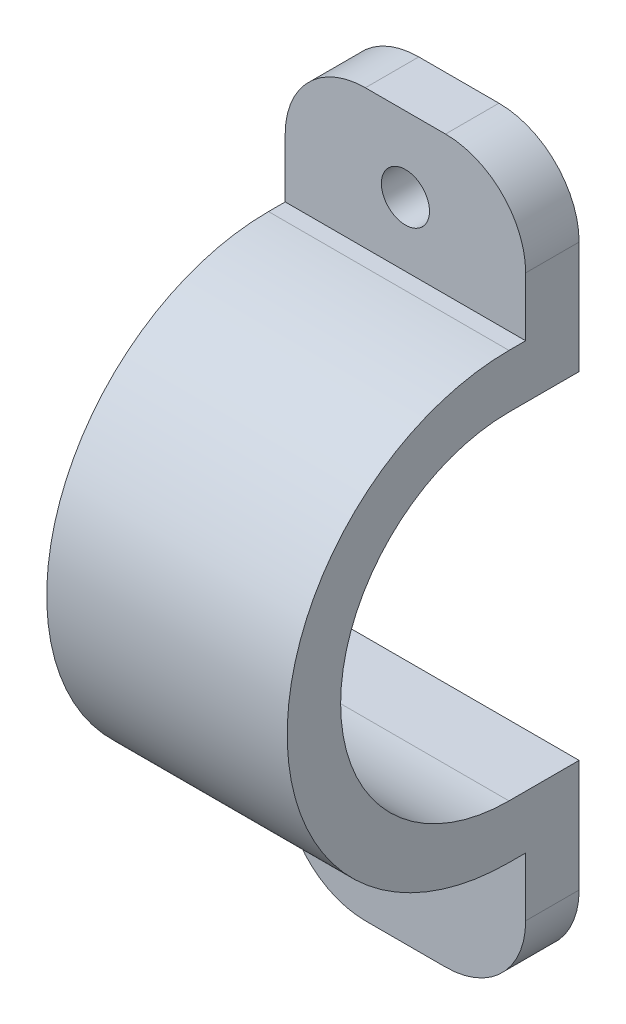
ISO-10303-21;
HEADER;
FILE_DESCRIPTION(('STEP AP214'),'2;1');
FILE_NAME('part.step','',(''),(''),'','','');
FILE_SCHEMA(('AUTOMOTIVE_DESIGN { 1 0 10303 214 1 1 1 1 }'));
ENDSEC;
DATA;
#1=APPLICATION_CONTEXT('core data for automotive mechanical design processes');
#2=APPLICATION_PROTOCOL_DEFINITION('international standard','automotive_design',2000,#1);
#3=PRODUCT_CONTEXT('',#1,'mechanical');
#4=PRODUCT('Part','Part','',(#3));
#5=PRODUCT_RELATED_PRODUCT_CATEGORY('part','',(#4));
#6=PRODUCT_DEFINITION_FORMATION('','',#4);
#7=PRODUCT_DEFINITION_CONTEXT('part definition',#1,'design');
#8=PRODUCT_DEFINITION('design','',#6,#7);
#9=PRODUCT_DEFINITION_SHAPE('','',#8);
#10=(LENGTH_UNIT() NAMED_UNIT(*) SI_UNIT(.MILLI.,.METRE.));
#11=(NAMED_UNIT(*) PLANE_ANGLE_UNIT() SI_UNIT($,.RADIAN.));
#12=(NAMED_UNIT(*) SI_UNIT($,.STERADIAN.) SOLID_ANGLE_UNIT());
#13=UNCERTAINTY_MEASURE_WITH_UNIT(LENGTH_MEASURE(1.E-05),#10,'distance_accuracy_value','');
#14=(GEOMETRIC_REPRESENTATION_CONTEXT(3) GLOBAL_UNCERTAINTY_ASSIGNED_CONTEXT((#13)) GLOBAL_UNIT_ASSIGNED_CONTEXT((#10,
#11,#12)) REPRESENTATION_CONTEXT('',''));
#15=CARTESIAN_POINT('',(0.,0.,0.));
#16=DIRECTION('',(0.,0.,1.));
#17=DIRECTION('',(1.,0.,0.));
#18=AXIS2_PLACEMENT_3D('',#15,#16,#17);
#19=CARTESIAN_POINT('',(18.,16.6,16.5));
#20=DIRECTION('',(0.,0.,-1.));
#21=DIRECTION('',(0.,1.,0.));
#22=AXIS2_PLACEMENT_3D('',#19,#20,#21);
#23=PLANE('',#22);
#24=DIRECTION('',(0.,-1.,0.));
#25=VECTOR('',#24,1.);
#26=CARTESIAN_POINT('',(18.,16.6,16.5));
#27=LINE('',#26,#25);
#28=CARTESIAN_POINT('',(18.,21.,16.5));
#29=VERTEX_POINT('',#28);
#30=CARTESIAN_POINT('',(18.,16.6,16.5));
#31=VERTEX_POINT('',#30);
#32=EDGE_CURVE('E149',#29,#31,#27,.T.);
#33=ORIENTED_EDGE('',*,*,#32,.F.);
#34=CARTESIAN_POINT('',(12.,21.,16.5));
#35=DIRECTION('',(0.,0.,-1.));
#36=DIRECTION('',(0.,1.,0.));
#37=AXIS2_PLACEMENT_3D('',#34,#35,#36);
#38=CIRCLE('',#37,6.);
#39=CARTESIAN_POINT('',(12.,27.,16.5));
#40=VERTEX_POINT('',#39);
#41=EDGE_CURVE('E185',#29,#40,#38,.F.);
#42=ORIENTED_EDGE('',*,*,#41,.T.);
#43=DIRECTION('',(-1.,0.,0.));
#44=VECTOR('',#43,1.);
#45=CARTESIAN_POINT('',(18.,27.,16.5));
#46=LINE('',#45,#44);
#47=CARTESIAN_POINT('',(6.,27.,16.5));
#48=VERTEX_POINT('',#47);
#49=EDGE_CURVE('E267',#40,#48,#46,.T.);
#50=ORIENTED_EDGE('',*,*,#49,.T.);
#51=CARTESIAN_POINT('',(6.,21.,16.5));
#52=DIRECTION('',(0.,0.,-1.));
#53=DIRECTION('',(0.,1.,0.));
#54=AXIS2_PLACEMENT_3D('',#51,#52,#53);
#55=CIRCLE('',#54,6.);
#56=CARTESIAN_POINT('',(0.,21.,16.5));
#57=VERTEX_POINT('',#56);
#58=EDGE_CURVE('E183',#48,#57,#55,.F.);
#59=ORIENTED_EDGE('',*,*,#58,.T.);
#60=DIRECTION('',(0.,-1.,0.));
#61=VECTOR('',#60,1.);
#62=CARTESIAN_POINT('',(0.,16.6,16.5));
#63=LINE('',#62,#61);
#64=CARTESIAN_POINT('',(0.,16.6,16.5));
#65=VERTEX_POINT('',#64);
#66=EDGE_CURVE('E172',#57,#65,#63,.T.);
#67=ORIENTED_EDGE('',*,*,#66,.T.);
#68=DIRECTION('',(-1.,0.,0.));
#69=VECTOR('',#68,1.);
#70=CARTESIAN_POINT('',(18.,16.6,16.5));
#71=LINE('',#70,#69);
#72=EDGE_CURVE('E164',#31,#65,#71,.T.);
#73=ORIENTED_EDGE('',*,*,#72,.F.);
#74=EDGE_LOOP('',(#33,#42,#50,#59,#67,#73));
#75=FACE_BOUND('',#74,.T.);
#76=CARTESIAN_POINT('',(9.,21.4,16.5));
#77=DIRECTION('',(0.,0.,1.));
#78=DIRECTION('',(1.,0.,0.));
#79=AXIS2_PLACEMENT_3D('',#76,#77,#78);
#80=CIRCLE('',#79,1.8);
#81=CARTESIAN_POINT('',(10.8,21.4,16.5));
#82=VERTEX_POINT('',#81);
#83=EDGE_CURVE('E484',#82,#82,#80,.T.);
#84=ORIENTED_EDGE('',*,*,#83,.F.);
#85=EDGE_LOOP('',(#84));
#86=FACE_BOUND('',#85,.T.);
#87=ADVANCED_FACE('F36',(#75,#86),#23,.F.);
#88=CARTESIAN_POINT('',(18.,16.6,17.75));
#89=DIRECTION('',(0.,-1.,0.));
#90=DIRECTION('',(0.,0.,-1.));
#91=AXIS2_PLACEMENT_3D('',#88,#89,#90);
#92=PLANE('',#91);
#93=DIRECTION('',(0.,0.,1.));
#94=VECTOR('',#93,1.);
#95=CARTESIAN_POINT('',(0.,16.6,17.75));
#96=LINE('',#95,#94);
#97=CARTESIAN_POINT('',(0.,16.6,17.75));
#98=VERTEX_POINT('',#97);
#99=EDGE_CURVE('E254',#65,#98,#96,.T.);
#100=ORIENTED_EDGE('',*,*,#99,.T.);
#101=DIRECTION('',(-1.,0.,0.));
#102=VECTOR('',#101,1.);
#103=CARTESIAN_POINT('',(18.,16.6,17.75));
#104=LINE('',#103,#102);
#105=CARTESIAN_POINT('',(18.,16.6,17.75));
#106=VERTEX_POINT('',#105);
#107=EDGE_CURVE('E166',#106,#98,#104,.T.);
#108=ORIENTED_EDGE('',*,*,#107,.F.);
#109=DIRECTION('',(0.,0.,1.));
#110=VECTOR('',#109,1.);
#111=CARTESIAN_POINT('',(18.,16.6,17.75));
#112=LINE('',#111,#110);
#113=EDGE_CURVE('E153',#31,#106,#112,.T.);
#114=ORIENTED_EDGE('',*,*,#113,.F.);
#115=ORIENTED_EDGE('',*,*,#72,.T.);
#116=EDGE_LOOP('',(#100,#108,#114,#115));
#117=FACE_BOUND('',#116,.T.);
#118=ADVANCED_FACE('F163',(#117),#92,.F.);
#119=CARTESIAN_POINT('',(18.,0.,17.75));
#120=DIRECTION('',(-1.,0.,0.));
#121=DIRECTION('',(0.,0.,1.));
#122=AXIS2_PLACEMENT_3D('',#119,#120,#121);
#123=CYLINDRICAL_SURFACE('',#122,16.6);
#124=CARTESIAN_POINT('',(0.,0.,17.75));
#125=DIRECTION('',(1.,0.,0.));
#126=DIRECTION('',(0.,0.,1.));
#127=AXIS2_PLACEMENT_3D('',#124,#125,#126);
#128=CIRCLE('',#127,16.6);
#129=CARTESIAN_POINT('',(0.,-16.6,17.75));
#130=VERTEX_POINT('',#129);
#131=EDGE_CURVE('E249',#98,#130,#128,.T.);
#132=ORIENTED_EDGE('',*,*,#131,.T.);
#133=DIRECTION('',(-1.,0.,0.));
#134=VECTOR('',#133,1.);
#135=CARTESIAN_POINT('',(18.,-16.6,17.75));
#136=LINE('',#135,#134);
#137=CARTESIAN_POINT('',(18.,-16.6,17.75));
#138=VERTEX_POINT('',#137);
#139=EDGE_CURVE('E178',#138,#130,#136,.T.);
#140=ORIENTED_EDGE('',*,*,#139,.F.);
#141=CARTESIAN_POINT('',(18.,0.,17.75));
#142=DIRECTION('',(1.,0.,0.));
#143=DIRECTION('',(0.,0.,1.));
#144=AXIS2_PLACEMENT_3D('',#141,#142,#143);
#145=CIRCLE('',#144,16.6);
#146=EDGE_CURVE('E168',#106,#138,#145,.T.);
#147=ORIENTED_EDGE('',*,*,#146,.F.);
#148=ORIENTED_EDGE('',*,*,#107,.T.);
#149=EDGE_LOOP('',(#132,#140,#147,#148));
#150=FACE_BOUND('',#149,.T.);
#151=ADVANCED_FACE('F309',(#150),#123,.T.);
#152=CARTESIAN_POINT('',(18.,-16.6,17.75));
#153=DIRECTION('',(0.,1.,0.));
#154=DIRECTION('',(0.,0.,1.));
#155=AXIS2_PLACEMENT_3D('',#152,#153,#154);
#156=PLANE('',#155);
#157=DIRECTION('',(0.,0.,-1.));
#158=VECTOR('',#157,1.);
#159=CARTESIAN_POINT('',(0.,-16.6,17.75));
#160=LINE('',#159,#158);
#161=CARTESIAN_POINT('',(0.,-16.6,16.5));
#162=VERTEX_POINT('',#161);
#163=EDGE_CURVE('E243',#130,#162,#160,.T.);
#164=ORIENTED_EDGE('',*,*,#163,.T.);
#165=DIRECTION('',(-1.,0.,0.));
#166=VECTOR('',#165,1.);
#167=CARTESIAN_POINT('',(18.,-16.6,16.5));
#168=LINE('',#167,#166);
#169=CARTESIAN_POINT('',(18.,-16.6,16.5));
#170=VERTEX_POINT('',#169);
#171=EDGE_CURVE('E231',#170,#162,#168,.T.);
#172=ORIENTED_EDGE('',*,*,#171,.F.);
#173=DIRECTION('',(0.,0.,-1.));
#174=VECTOR('',#173,1.);
#175=CARTESIAN_POINT('',(18.,-16.6,17.75));
#176=LINE('',#175,#174);
#177=EDGE_CURVE('E218',#138,#170,#176,.T.);
#178=ORIENTED_EDGE('',*,*,#177,.F.);
#179=ORIENTED_EDGE('',*,*,#139,.T.);
#180=EDGE_LOOP('',(#164,#172,#178,#179));
#181=FACE_BOUND('',#180,.T.);
#182=ADVANCED_FACE('F242',(#181),#156,.F.);
#183=CARTESIAN_POINT('',(18.,-16.6,16.5));
#184=DIRECTION('',(0.,0.,-1.));
#185=DIRECTION('',(0.,1.,0.));
#186=AXIS2_PLACEMENT_3D('',#183,#184,#185);
#187=PLANE('',#186);
#188=CARTESIAN_POINT('',(9.,-21.4,16.5));
#189=DIRECTION('',(0.,0.,1.));
#190=DIRECTION('',(1.,0.,0.));
#191=AXIS2_PLACEMENT_3D('',#188,#189,#190);
#192=CIRCLE('',#191,1.8);
#193=CARTESIAN_POINT('',(10.8,-21.4,16.5));
#194=VERTEX_POINT('',#193);
#195=EDGE_CURVE('E479',#194,#194,#192,.T.);
#196=ORIENTED_EDGE('',*,*,#195,.F.);
#197=EDGE_LOOP('',(#196));
#198=FACE_BOUND('',#197,.T.);
#199=DIRECTION('',(0.,-1.,0.));
#200=VECTOR('',#199,1.);
#201=CARTESIAN_POINT('',(0.,-16.6,16.5));
#202=LINE('',#201,#200);
#203=CARTESIAN_POINT('',(0.,-21.,16.5));
#204=VERTEX_POINT('',#203);
#205=EDGE_CURVE('E250',#162,#204,#202,.T.);
#206=ORIENTED_EDGE('',*,*,#205,.T.);
#207=CARTESIAN_POINT('',(6.,-21.,16.5));
#208=DIRECTION('',(0.,0.,-1.));
#209=DIRECTION('',(0.,1.,0.));
#210=AXIS2_PLACEMENT_3D('',#207,#208,#209);
#211=CIRCLE('',#210,6.);
#212=CARTESIAN_POINT('',(6.,-27.,16.5));
#213=VERTEX_POINT('',#212);
#214=EDGE_CURVE('E11',#204,#213,#211,.F.);
#215=ORIENTED_EDGE('',*,*,#214,.T.);
#216=DIRECTION('',(-1.,0.,0.));
#217=VECTOR('',#216,1.);
#218=CARTESIAN_POINT('',(18.,-27.,16.5));
#219=LINE('',#218,#217);
#220=CARTESIAN_POINT('',(12.,-27.,16.5));
#221=VERTEX_POINT('',#220);
#222=EDGE_CURVE('E213',#221,#213,#219,.T.);
#223=ORIENTED_EDGE('',*,*,#222,.F.);
#224=CARTESIAN_POINT('',(12.,-21.,16.5));
#225=DIRECTION('',(0.,0.,-1.));
#226=DIRECTION('',(0.,1.,0.));
#227=AXIS2_PLACEMENT_3D('',#224,#225,#226);
#228=CIRCLE('',#227,6.);
#229=CARTESIAN_POINT('',(18.,-21.,16.5));
#230=VERTEX_POINT('',#229);
#231=EDGE_CURVE('E44',#221,#230,#228,.F.);
#232=ORIENTED_EDGE('',*,*,#231,.T.);
#233=DIRECTION('',(0.,-1.,0.));
#234=VECTOR('',#233,1.);
#235=CARTESIAN_POINT('',(18.,-16.6,16.5));
#236=LINE('',#235,#234);
#237=EDGE_CURVE('E212',#170,#230,#236,.T.);
#238=ORIENTED_EDGE('',*,*,#237,.F.);
#239=ORIENTED_EDGE('',*,*,#171,.T.);
#240=EDGE_LOOP('',(#206,#215,#223,#232,#238,#239));
#241=FACE_BOUND('',#240,.T.);
#242=ADVANCED_FACE('F210',(#198,#241),#187,.F.);
#243=CARTESIAN_POINT('',(18.,-27.,16.5));
#244=DIRECTION('',(0.,1.,0.));
#245=DIRECTION('',(0.,0.,1.));
#246=AXIS2_PLACEMENT_3D('',#243,#244,#245);
#247=PLANE('',#246);
#248=ORIENTED_EDGE('',*,*,#222,.T.);
#249=DIRECTION('',(0.,0.,-1.));
#250=VECTOR('',#249,1.);
#251=CARTESIAN_POINT('',(6.,-27.,16.5));
#252=LINE('',#251,#250);
#253=CARTESIAN_POINT('',(6.,-27.,12.5));
#254=VERTEX_POINT('',#253);
#255=EDGE_CURVE('E201',#213,#254,#252,.T.);
#256=ORIENTED_EDGE('',*,*,#255,.T.);
#257=DIRECTION('',(-1.,0.,0.));
#258=VECTOR('',#257,1.);
#259=CARTESIAN_POINT('',(18.,-27.,12.5));
#260=LINE('',#259,#258);
#261=CARTESIAN_POINT('',(12.,-27.,12.5));
#262=VERTEX_POINT('',#261);
#263=EDGE_CURVE('E225',#262,#254,#260,.T.);
#264=ORIENTED_EDGE('',*,*,#263,.F.);
#265=DIRECTION('',(0.,0.,-1.));
#266=VECTOR('',#265,1.);
#267=CARTESIAN_POINT('',(12.,-27.,16.5));
#268=LINE('',#267,#266);
#269=EDGE_CURVE('E56',#262,#221,#268,.F.);
#270=ORIENTED_EDGE('',*,*,#269,.T.);
#271=EDGE_LOOP('',(#248,#256,#264,#270));
#272=FACE_BOUND('',#271,.T.);
#273=ADVANCED_FACE('F227',(#272),#247,.F.);
#274=CARTESIAN_POINT('',(18.,-27.,12.5));
#275=DIRECTION('',(0.,0.,1.));
#276=DIRECTION('',(1.,0.,0.));
#277=AXIS2_PLACEMENT_3D('',#274,#275,#276);
#278=PLANE('',#277);
#279=CARTESIAN_POINT('',(9.,-21.4,12.5));
#280=DIRECTION('',(0.,0.,1.));
#281=DIRECTION('',(1.,0.,0.));
#282=AXIS2_PLACEMENT_3D('',#279,#280,#281);
#283=CIRCLE('',#282,1.8);
#284=CARTESIAN_POINT('',(10.8,-21.4,12.5));
#285=VERTEX_POINT('',#284);
#286=EDGE_CURVE('E308',#285,#285,#283,.T.);
#287=ORIENTED_EDGE('',*,*,#286,.T.);
#288=EDGE_LOOP('',(#287));
#289=FACE_BOUND('',#288,.T.);
#290=ORIENTED_EDGE('',*,*,#263,.T.);
#291=CARTESIAN_POINT('',(6.,-21.,12.5));
#292=DIRECTION('',(0.,0.,1.));
#293=DIRECTION('',(1.,0.,0.));
#294=AXIS2_PLACEMENT_3D('',#291,#292,#293);
#295=CIRCLE('',#294,6.);
#296=CARTESIAN_POINT('',(0.,-21.,12.5));
#297=VERTEX_POINT('',#296);
#298=EDGE_CURVE('E206',#254,#297,#295,.F.);
#299=ORIENTED_EDGE('',*,*,#298,.T.);
#300=DIRECTION('',(0.,1.,0.));
#301=VECTOR('',#300,1.);
#302=CARTESIAN_POINT('',(0.,-27.,12.5));
#303=LINE('',#302,#301);
#304=CARTESIAN_POINT('',(0.,-12.6,12.5));
#305=VERTEX_POINT('',#304);
#306=EDGE_CURVE('E252',#297,#305,#303,.T.);
#307=ORIENTED_EDGE('',*,*,#306,.T.);
#308=DIRECTION('',(-1.,0.,0.));
#309=VECTOR('',#308,1.);
#310=CARTESIAN_POINT('',(18.,-12.6,12.5));
#311=LINE('',#310,#309);
#312=CARTESIAN_POINT('',(18.,-12.6,12.5));
#313=VERTEX_POINT('',#312);
#314=EDGE_CURVE('E229',#313,#305,#311,.T.);
#315=ORIENTED_EDGE('',*,*,#314,.F.);
#316=DIRECTION('',(0.,1.,0.));
#317=VECTOR('',#316,1.);
#318=CARTESIAN_POINT('',(18.,-27.,12.5));
#319=LINE('',#318,#317);
#320=CARTESIAN_POINT('',(18.,-21.,12.5));
#321=VERTEX_POINT('',#320);
#322=EDGE_CURVE('E220',#321,#313,#319,.T.);
#323=ORIENTED_EDGE('',*,*,#322,.F.);
#324=CARTESIAN_POINT('',(12.,-21.,12.5));
#325=DIRECTION('',(0.,0.,1.));
#326=DIRECTION('',(1.,0.,0.));
#327=AXIS2_PLACEMENT_3D('',#324,#325,#326);
#328=CIRCLE('',#327,6.);
#329=EDGE_CURVE('E204',#321,#262,#328,.F.);
#330=ORIENTED_EDGE('',*,*,#329,.T.);
#331=EDGE_LOOP('',(#290,#299,#307,#315,#323,#330));
#332=FACE_BOUND('',#331,.T.);
#333=ADVANCED_FACE('F224',(#289,#332),#278,.F.);
#334=CARTESIAN_POINT('',(18.,-12.6,12.5));
#335=DIRECTION('',(0.,-1.,0.));
#336=DIRECTION('',(0.,0.,-1.));
#337=AXIS2_PLACEMENT_3D('',#334,#335,#336);
#338=PLANE('',#337);
#339=DIRECTION('',(0.,0.,1.));
#340=VECTOR('',#339,1.);
#341=CARTESIAN_POINT('',(0.,-12.6,12.5));
#342=LINE('',#341,#340);
#343=CARTESIAN_POINT('',(0.,-12.6,17.75));
#344=VERTEX_POINT('',#343);
#345=EDGE_CURVE('E259',#305,#344,#342,.T.);
#346=ORIENTED_EDGE('',*,*,#345,.T.);
#347=DIRECTION('',(-1.,0.,0.));
#348=VECTOR('',#347,1.);
#349=CARTESIAN_POINT('',(18.,-12.6,17.75));
#350=LINE('',#349,#348);
#351=CARTESIAN_POINT('',(18.,-12.6,17.75));
#352=VERTEX_POINT('',#351);
#353=EDGE_CURVE('E234',#352,#344,#350,.T.);
#354=ORIENTED_EDGE('',*,*,#353,.F.);
#355=DIRECTION('',(0.,0.,1.));
#356=VECTOR('',#355,1.);
#357=CARTESIAN_POINT('',(18.,-12.6,12.5));
#358=LINE('',#357,#356);
#359=EDGE_CURVE('E314',#313,#352,#358,.T.);
#360=ORIENTED_EDGE('',*,*,#359,.F.);
#361=ORIENTED_EDGE('',*,*,#314,.T.);
#362=EDGE_LOOP('',(#346,#354,#360,#361));
#363=FACE_BOUND('',#362,.T.);
#364=ADVANCED_FACE('F315',(#363),#338,.F.);
#365=CARTESIAN_POINT('',(18.,0.,17.75));
#366=DIRECTION('',(-1.,0.,0.));
#367=DIRECTION('',(0.,0.,1.));
#368=AXIS2_PLACEMENT_3D('',#365,#366,#367);
#369=CYLINDRICAL_SURFACE('',#368,12.6);
#370=CARTESIAN_POINT('',(0.,0.,17.75));
#371=DIRECTION('',(-1.,0.,0.));
#372=DIRECTION('',(0.,0.,-1.));
#373=AXIS2_PLACEMENT_3D('',#370,#371,#372);
#374=CIRCLE('',#373,12.6);
#375=CARTESIAN_POINT('',(0.,12.6,17.75));
#376=VERTEX_POINT('',#375);
#377=EDGE_CURVE('E261',#344,#376,#374,.T.);
#378=ORIENTED_EDGE('',*,*,#377,.T.);
#379=DIRECTION('',(-1.,0.,0.));
#380=VECTOR('',#379,1.);
#381=CARTESIAN_POINT('',(18.,12.6,17.75));
#382=LINE('',#381,#380);
#383=CARTESIAN_POINT('',(18.,12.6,17.75));
#384=VERTEX_POINT('',#383);
#385=EDGE_CURVE('E277',#384,#376,#382,.T.);
#386=ORIENTED_EDGE('',*,*,#385,.F.);
#387=CARTESIAN_POINT('',(18.,0.,17.75));
#388=DIRECTION('',(-1.,0.,0.));
#389=DIRECTION('',(0.,0.,-1.));
#390=AXIS2_PLACEMENT_3D('',#387,#388,#389);
#391=CIRCLE('',#390,12.6);
#392=EDGE_CURVE('E286',#352,#384,#391,.T.);
#393=ORIENTED_EDGE('',*,*,#392,.F.);
#394=ORIENTED_EDGE('',*,*,#353,.T.);
#395=EDGE_LOOP('',(#378,#386,#393,#394));
#396=FACE_BOUND('',#395,.T.);
#397=ADVANCED_FACE('F284',(#396),#369,.F.);
#398=CARTESIAN_POINT('',(18.,12.6,12.5));
#399=DIRECTION('',(0.,1.,0.));
#400=DIRECTION('',(0.,0.,1.));
#401=AXIS2_PLACEMENT_3D('',#398,#399,#400);
#402=PLANE('',#401);
#403=DIRECTION('',(0.,0.,-1.));
#404=VECTOR('',#403,1.);
#405=CARTESIAN_POINT('',(0.,12.6,12.5));
#406=LINE('',#405,#404);
#407=CARTESIAN_POINT('',(0.,12.6,12.5));
#408=VERTEX_POINT('',#407);
#409=EDGE_CURVE('E263',#376,#408,#406,.T.);
#410=ORIENTED_EDGE('',*,*,#409,.T.);
#411=DIRECTION('',(-1.,0.,0.));
#412=VECTOR('',#411,1.);
#413=CARTESIAN_POINT('',(18.,12.6,12.5));
#414=LINE('',#413,#412);
#415=CARTESIAN_POINT('',(18.,12.6,12.5));
#416=VERTEX_POINT('',#415);
#417=EDGE_CURVE('E274',#416,#408,#414,.T.);
#418=ORIENTED_EDGE('',*,*,#417,.F.);
#419=DIRECTION('',(0.,0.,-1.));
#420=VECTOR('',#419,1.);
#421=CARTESIAN_POINT('',(18.,12.6,12.5));
#422=LINE('',#421,#420);
#423=EDGE_CURVE('E303',#384,#416,#422,.T.);
#424=ORIENTED_EDGE('',*,*,#423,.F.);
#425=ORIENTED_EDGE('',*,*,#385,.T.);
#426=EDGE_LOOP('',(#410,#418,#424,#425));
#427=FACE_BOUND('',#426,.T.);
#428=ADVANCED_FACE('F295',(#427),#402,.F.);
#429=CARTESIAN_POINT('',(18.,27.,12.5));
#430=DIRECTION('',(0.,0.,1.));
#431=DIRECTION('',(1.,0.,0.));
#432=AXIS2_PLACEMENT_3D('',#429,#430,#431);
#433=PLANE('',#432);
#434=CARTESIAN_POINT('',(9.,21.4,12.5));
#435=DIRECTION('',(0.,0.,1.));
#436=DIRECTION('',(1.,0.,0.));
#437=AXIS2_PLACEMENT_3D('',#434,#435,#436);
#438=CIRCLE('',#437,1.8);
#439=CARTESIAN_POINT('',(10.8,21.4,12.5));
#440=VERTEX_POINT('',#439);
#441=EDGE_CURVE('E480',#440,#440,#438,.T.);
#442=ORIENTED_EDGE('',*,*,#441,.T.);
#443=EDGE_LOOP('',(#442));
#444=FACE_BOUND('',#443,.T.);
#445=DIRECTION('',(-1.,0.,0.));
#446=VECTOR('',#445,1.);
#447=CARTESIAN_POINT('',(18.,27.,12.5));
#448=LINE('',#447,#446);
#449=CARTESIAN_POINT('',(12.,27.,12.5));
#450=VERTEX_POINT('',#449);
#451=CARTESIAN_POINT('',(6.,27.,12.5));
#452=VERTEX_POINT('',#451);
#453=EDGE_CURVE('E270',#450,#452,#448,.T.);
#454=ORIENTED_EDGE('',*,*,#453,.F.);
#455=CARTESIAN_POINT('',(12.,21.,12.5));
#456=DIRECTION('',(0.,0.,1.));
#457=DIRECTION('',(1.,0.,0.));
#458=AXIS2_PLACEMENT_3D('',#455,#456,#457);
#459=CIRCLE('',#458,6.);
#460=CARTESIAN_POINT('',(18.,21.,12.5));
#461=VERTEX_POINT('',#460);
#462=EDGE_CURVE('E194',#450,#461,#459,.F.);
#463=ORIENTED_EDGE('',*,*,#462,.T.);
#464=DIRECTION('',(0.,1.,0.));
#465=VECTOR('',#464,1.);
#466=CARTESIAN_POINT('',(18.,27.,12.5));
#467=LINE('',#466,#465);
#468=EDGE_CURVE('E271',#416,#461,#467,.T.);
#469=ORIENTED_EDGE('',*,*,#468,.F.);
#470=ORIENTED_EDGE('',*,*,#417,.T.);
#471=DIRECTION('',(0.,1.,0.));
#472=VECTOR('',#471,1.);
#473=CARTESIAN_POINT('',(0.,27.,12.5));
#474=LINE('',#473,#472);
#475=CARTESIAN_POINT('',(0.,21.,12.5));
#476=VERTEX_POINT('',#475);
#477=EDGE_CURVE('E159',#408,#476,#474,.T.);
#478=ORIENTED_EDGE('',*,*,#477,.T.);
#479=CARTESIAN_POINT('',(6.,21.,12.5));
#480=DIRECTION('',(0.,0.,1.));
#481=DIRECTION('',(1.,0.,0.));
#482=AXIS2_PLACEMENT_3D('',#479,#480,#481);
#483=CIRCLE('',#482,6.);
#484=EDGE_CURVE('E192',#476,#452,#483,.F.);
#485=ORIENTED_EDGE('',*,*,#484,.T.);
#486=EDGE_LOOP('',(#454,#463,#469,#470,#478,#485));
#487=FACE_BOUND('',#486,.T.);
#488=ADVANCED_FACE('F300',(#444,#487),#433,.F.);
#489=CARTESIAN_POINT('',(18.,27.,16.5));
#490=DIRECTION('',(0.,-1.,0.));
#491=DIRECTION('',(0.,0.,-1.));
#492=AXIS2_PLACEMENT_3D('',#489,#490,#491);
#493=PLANE('',#492);
#494=ORIENTED_EDGE('',*,*,#49,.F.);
#495=DIRECTION('',(0.,0.,1.));
#496=VECTOR('',#495,1.);
#497=CARTESIAN_POINT('',(12.,27.,12.5));
#498=LINE('',#497,#496);
#499=EDGE_CURVE('E190',#40,#450,#498,.F.);
#500=ORIENTED_EDGE('',*,*,#499,.T.);
#501=ORIENTED_EDGE('',*,*,#453,.T.);
#502=DIRECTION('',(0.,0.,1.));
#503=VECTOR('',#502,1.);
#504=CARTESIAN_POINT('',(6.,27.,16.5));
#505=LINE('',#504,#503);
#506=EDGE_CURVE('E187',#452,#48,#505,.T.);
#507=ORIENTED_EDGE('',*,*,#506,.T.);
#508=EDGE_LOOP('',(#494,#500,#501,#507));
#509=FACE_BOUND('',#508,.T.);
#510=ADVANCED_FACE('F348',(#509),#493,.F.);
#511=CARTESIAN_POINT('',(18.,0.,17.75));
#512=DIRECTION('',(1.,0.,0.));
#513=DIRECTION('',(0.,0.,-1.));
#514=AXIS2_PLACEMENT_3D('',#511,#512,#513);
#515=PLANE('',#514);
#516=ORIENTED_EDGE('',*,*,#468,.T.);
#517=DIRECTION('',(0.,0.,1.));
#518=VECTOR('',#517,1.);
#519=CARTESIAN_POINT('',(18.,21.,16.5));
#520=LINE('',#519,#518);
#521=EDGE_CURVE('E156',#461,#29,#520,.T.);
#522=ORIENTED_EDGE('',*,*,#521,.T.);
#523=ORIENTED_EDGE('',*,*,#32,.T.);
#524=ORIENTED_EDGE('',*,*,#113,.T.);
#525=ORIENTED_EDGE('',*,*,#146,.T.);
#526=ORIENTED_EDGE('',*,*,#177,.T.);
#527=ORIENTED_EDGE('',*,*,#237,.T.);
#528=DIRECTION('',(0.,0.,-1.));
#529=VECTOR('',#528,1.);
#530=CARTESIAN_POINT('',(18.,-21.,12.5));
#531=LINE('',#530,#529);
#532=EDGE_CURVE('E174',#230,#321,#531,.T.);
#533=ORIENTED_EDGE('',*,*,#532,.T.);
#534=ORIENTED_EDGE('',*,*,#322,.T.);
#535=ORIENTED_EDGE('',*,*,#359,.T.);
#536=ORIENTED_EDGE('',*,*,#392,.T.);
#537=ORIENTED_EDGE('',*,*,#423,.T.);
#538=EDGE_LOOP('',(#516,#522,#523,#524,#525,#526,#527,#533,#534,#535,#536,#537));
#539=FACE_BOUND('',#538,.T.);
#540=ADVANCED_FACE('F152',(#539),#515,.T.);
#541=CARTESIAN_POINT('',(0.,0.,17.75));
#542=DIRECTION('',(1.,0.,0.));
#543=DIRECTION('',(0.,0.,-1.));
#544=AXIS2_PLACEMENT_3D('',#541,#542,#543);
#545=PLANE('',#544);
#546=ORIENTED_EDGE('',*,*,#66,.F.);
#547=DIRECTION('',(0.,0.,1.));
#548=VECTOR('',#547,1.);
#549=CARTESIAN_POINT('',(0.,21.,17.75));
#550=LINE('',#549,#548);
#551=EDGE_CURVE('E198',#57,#476,#550,.F.);
#552=ORIENTED_EDGE('',*,*,#551,.T.);
#553=ORIENTED_EDGE('',*,*,#477,.F.);
#554=ORIENTED_EDGE('',*,*,#409,.F.);
#555=ORIENTED_EDGE('',*,*,#377,.F.);
#556=ORIENTED_EDGE('',*,*,#345,.F.);
#557=ORIENTED_EDGE('',*,*,#306,.F.);
#558=DIRECTION('',(0.,0.,-1.));
#559=VECTOR('',#558,1.);
#560=CARTESIAN_POINT('',(0.,-21.,17.75));
#561=LINE('',#560,#559);
#562=EDGE_CURVE('E196',#297,#204,#561,.F.);
#563=ORIENTED_EDGE('',*,*,#562,.T.);
#564=ORIENTED_EDGE('',*,*,#205,.F.);
#565=ORIENTED_EDGE('',*,*,#163,.F.);
#566=ORIENTED_EDGE('',*,*,#131,.F.);
#567=ORIENTED_EDGE('',*,*,#99,.F.);
#568=EDGE_LOOP('',(#546,#552,#553,#554,#555,#556,#557,#563,#564,#565,#566,#567));
#569=FACE_BOUND('',#568,.T.);
#570=ADVANCED_FACE('F248',(#569),#545,.F.);
#571=CARTESIAN_POINT('',(9.,-21.4,16.5));
#572=DIRECTION('',(0.,0.,1.));
#573=DIRECTION('',(1.,0.,0.));
#574=AXIS2_PLACEMENT_3D('',#571,#572,#573);
#575=CYLINDRICAL_SURFACE('',#574,1.8);
#576=ORIENTED_EDGE('',*,*,#286,.F.);
#577=EDGE_LOOP('',(#576));
#578=FACE_BOUND('',#577,.T.);
#579=ORIENTED_EDGE('',*,*,#195,.T.);
#580=EDGE_LOOP('',(#579));
#581=FACE_BOUND('',#580,.T.);
#582=ADVANCED_FACE('F342',(#578,#581),#575,.F.);
#583=CARTESIAN_POINT('',(9.,21.4,16.5));
#584=DIRECTION('',(0.,0.,1.));
#585=DIRECTION('',(1.,0.,0.));
#586=AXIS2_PLACEMENT_3D('',#583,#584,#585);
#587=CYLINDRICAL_SURFACE('',#586,1.8);
#588=ORIENTED_EDGE('',*,*,#441,.F.);
#589=EDGE_LOOP('',(#588));
#590=FACE_BOUND('',#589,.T.);
#591=ORIENTED_EDGE('',*,*,#83,.T.);
#592=EDGE_LOOP('',(#591));
#593=FACE_BOUND('',#592,.T.);
#594=ADVANCED_FACE('F337',(#590,#593),#587,.F.);
#595=CARTESIAN_POINT('',(12.,21.,17.75));
#596=DIRECTION('',(0.,0.,-1.));
#597=DIRECTION('',(-1.,0.,0.));
#598=AXIS2_PLACEMENT_3D('',#595,#596,#597);
#599=CYLINDRICAL_SURFACE('',#598,6.);
#600=ORIENTED_EDGE('',*,*,#462,.F.);
#601=ORIENTED_EDGE('',*,*,#499,.F.);
#602=ORIENTED_EDGE('',*,*,#41,.F.);
#603=ORIENTED_EDGE('',*,*,#521,.F.);
#604=EDGE_LOOP('',(#600,#601,#602,#603));
#605=FACE_BOUND('',#604,.T.);
#606=ADVANCED_FACE('F325',(#605),#599,.T.);
#607=CARTESIAN_POINT('',(6.,21.,16.5));
#608=DIRECTION('',(0.,0.,1.));
#609=DIRECTION('',(1.,0.,0.));
#610=AXIS2_PLACEMENT_3D('',#607,#608,#609);
#611=CYLINDRICAL_SURFACE('',#610,6.);
#612=ORIENTED_EDGE('',*,*,#484,.F.);
#613=ORIENTED_EDGE('',*,*,#551,.F.);
#614=ORIENTED_EDGE('',*,*,#58,.F.);
#615=ORIENTED_EDGE('',*,*,#506,.F.);
#616=EDGE_LOOP('',(#612,#613,#614,#615));
#617=FACE_BOUND('',#616,.T.);
#618=ADVANCED_FACE('F320',(#617),#611,.T.);
#619=CARTESIAN_POINT('',(6.,-21.,16.5));
#620=DIRECTION('',(0.,0.,-1.));
#621=DIRECTION('',(-1.,0.,0.));
#622=AXIS2_PLACEMENT_3D('',#619,#620,#621);
#623=CYLINDRICAL_SURFACE('',#622,6.);
#624=ORIENTED_EDGE('',*,*,#214,.F.);
#625=ORIENTED_EDGE('',*,*,#562,.F.);
#626=ORIENTED_EDGE('',*,*,#298,.F.);
#627=ORIENTED_EDGE('',*,*,#255,.F.);
#628=EDGE_LOOP('',(#624,#625,#626,#627));
#629=FACE_BOUND('',#628,.T.);
#630=ADVANCED_FACE('F318',(#629),#623,.T.);
#631=CARTESIAN_POINT('',(12.,-21.,17.75));
#632=DIRECTION('',(0.,0.,1.));
#633=DIRECTION('',(1.,0.,0.));
#634=AXIS2_PLACEMENT_3D('',#631,#632,#633);
#635=CYLINDRICAL_SURFACE('',#634,6.);
#636=ORIENTED_EDGE('',*,*,#231,.F.);
#637=ORIENTED_EDGE('',*,*,#269,.F.);
#638=ORIENTED_EDGE('',*,*,#329,.F.);
#639=ORIENTED_EDGE('',*,*,#532,.F.);
#640=EDGE_LOOP('',(#636,#637,#638,#639));
#641=FACE_BOUND('',#640,.T.);
#642=ADVANCED_FACE('F38',(#641),#635,.T.);
#643=CLOSED_SHELL('',(#87,#118,#151,#182,#242,#273,#333,#364,#397,#428,#488,#510,#540,#570,#582,
#594,#606,#618,#630,#642));
#644=MANIFOLD_SOLID_BREP('B2',#643);
#645=ADVANCED_BREP_SHAPE_REPRESENTATION('',(#18,#644),#14);
#646=SHAPE_DEFINITION_REPRESENTATION(#9,#645);
ENDSEC;
END-ISO-10303-21;
